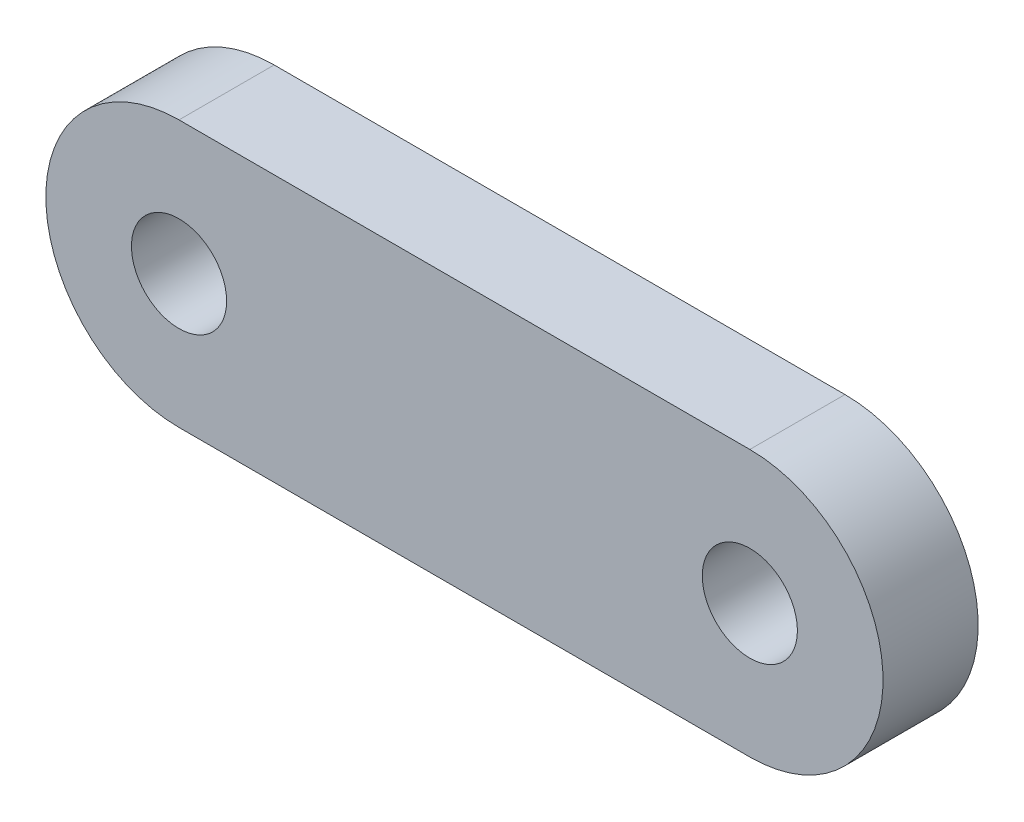
ISO-10303-21;
HEADER;
FILE_DESCRIPTION(('STEP AP214'),'2;1');
FILE_NAME('part.step','',(''),(''),'','','');
FILE_SCHEMA(('AUTOMOTIVE_DESIGN { 1 0 10303 214 1 1 1 1 }'));
ENDSEC;
DATA;
#1=APPLICATION_CONTEXT('core data for automotive mechanical design processes');
#2=APPLICATION_PROTOCOL_DEFINITION('international standard','automotive_design',2000,#1);
#3=PRODUCT_CONTEXT('',#1,'mechanical');
#4=PRODUCT('Part','Part','',(#3));
#5=PRODUCT_RELATED_PRODUCT_CATEGORY('part','',(#4));
#6=PRODUCT_DEFINITION_FORMATION('','',#4);
#7=PRODUCT_DEFINITION_CONTEXT('part definition',#1,'design');
#8=PRODUCT_DEFINITION('design','',#6,#7);
#9=PRODUCT_DEFINITION_SHAPE('','',#8);
#10=(LENGTH_UNIT() NAMED_UNIT(*) SI_UNIT(.MILLI.,.METRE.));
#11=(NAMED_UNIT(*) PLANE_ANGLE_UNIT() SI_UNIT($,.RADIAN.));
#12=(NAMED_UNIT(*) SI_UNIT($,.STERADIAN.) SOLID_ANGLE_UNIT());
#13=UNCERTAINTY_MEASURE_WITH_UNIT(LENGTH_MEASURE(1.E-05),#10,'distance_accuracy_value','');
#14=(GEOMETRIC_REPRESENTATION_CONTEXT(3) GLOBAL_UNCERTAINTY_ASSIGNED_CONTEXT((#13)) GLOBAL_UNIT_ASSIGNED_CONTEXT((#10,
#11,#12)) REPRESENTATION_CONTEXT('',''));
#15=CARTESIAN_POINT('',(0.,0.,0.));
#16=DIRECTION('',(0.,0.,1.));
#17=DIRECTION('',(1.,0.,0.));
#18=AXIS2_PLACEMENT_3D('',#15,#16,#17);
#19=CARTESIAN_POINT('',(19.05,0.,6.35));
#20=DIRECTION('',(0.,0.,-1.));
#21=DIRECTION('',(-1.,0.,0.));
#22=AXIS2_PLACEMENT_3D('',#19,#20,#21);
#23=PLANE('',#22);
#24=CARTESIAN_POINT('',(19.05,0.,6.35));
#25=DIRECTION('',(0.,0.,1.));
#26=DIRECTION('',(-1.,0.,0.));
#27=AXIS2_PLACEMENT_3D('',#24,#25,#26);
#28=CIRCLE('',#27,8.89);
#29=CARTESIAN_POINT('',(19.05,-8.89,6.35));
#30=VERTEX_POINT('',#29);
#31=CARTESIAN_POINT('',(19.05,8.89,6.35));
#32=VERTEX_POINT('',#31);
#33=EDGE_CURVE('E98',#30,#32,#28,.T.);
#34=ORIENTED_EDGE('',*,*,#33,.T.);
#35=DIRECTION('',(-1.,0.,0.));
#36=VECTOR('',#35,1.);
#37=CARTESIAN_POINT('',(-19.05,8.89,6.35));
#38=LINE('',#37,#36);
#39=CARTESIAN_POINT('',(-19.05,8.89,6.35));
#40=VERTEX_POINT('',#39);
#41=EDGE_CURVE('E91',#32,#40,#38,.T.);
#42=ORIENTED_EDGE('',*,*,#41,.T.);
#43=CARTESIAN_POINT('',(-19.05,0.,6.35));
#44=DIRECTION('',(0.,0.,1.));
#45=DIRECTION('',(1.,0.,0.));
#46=AXIS2_PLACEMENT_3D('',#43,#44,#45);
#47=CIRCLE('',#46,8.89);
#48=CARTESIAN_POINT('',(-19.05,-8.89,6.35));
#49=VERTEX_POINT('',#48);
#50=EDGE_CURVE('E96',#40,#49,#47,.T.);
#51=ORIENTED_EDGE('',*,*,#50,.T.);
#52=DIRECTION('',(1.,0.,0.));
#53=VECTOR('',#52,1.);
#54=CARTESIAN_POINT('',(-19.05,-8.89,6.35));
#55=LINE('',#54,#53);
#56=EDGE_CURVE('E65',#49,#30,#55,.T.);
#57=ORIENTED_EDGE('',*,*,#56,.T.);
#58=EDGE_LOOP('',(#34,#42,#51,#57));
#59=FACE_BOUND('',#58,.T.);
#60=CARTESIAN_POINT('',(-19.05,0.,6.35));
#61=DIRECTION('',(0.,0.,1.));
#62=DIRECTION('',(1.,0.,0.));
#63=AXIS2_PLACEMENT_3D('',#60,#61,#62);
#64=CIRCLE('',#63,3.175);
#65=CARTESIAN_POINT('',(-15.875,0.,6.35));
#66=VERTEX_POINT('',#65);
#67=EDGE_CURVE('E120',#66,#66,#64,.T.);
#68=ORIENTED_EDGE('',*,*,#67,.F.);
#69=EDGE_LOOP('',(#68));
#70=FACE_BOUND('',#69,.T.);
#71=CARTESIAN_POINT('',(19.05,0.,6.35));
#72=DIRECTION('',(0.,0.,1.));
#73=DIRECTION('',(1.,0.,0.));
#74=AXIS2_PLACEMENT_3D('',#71,#72,#73);
#75=CIRCLE('',#74,3.175);
#76=CARTESIAN_POINT('',(22.225,0.,6.35));
#77=VERTEX_POINT('',#76);
#78=EDGE_CURVE('E138',#77,#77,#75,.T.);
#79=ORIENTED_EDGE('',*,*,#78,.F.);
#80=EDGE_LOOP('',(#79));
#81=FACE_BOUND('',#80,.T.);
#82=ADVANCED_FACE('F44',(#59,#70,#81),#23,.F.);
#83=CARTESIAN_POINT('',(19.05,0.,0.));
#84=DIRECTION('',(0.,0.,-1.));
#85=DIRECTION('',(-1.,0.,0.));
#86=AXIS2_PLACEMENT_3D('',#83,#84,#85);
#87=PLANE('',#86);
#88=CARTESIAN_POINT('',(-19.05,0.,0.));
#89=DIRECTION('',(0.,0.,1.));
#90=DIRECTION('',(1.,0.,0.));
#91=AXIS2_PLACEMENT_3D('',#88,#89,#90);
#92=CIRCLE('',#91,3.175);
#93=CARTESIAN_POINT('',(-15.875,0.,0.));
#94=VERTEX_POINT('',#93);
#95=EDGE_CURVE('E137',#94,#94,#92,.T.);
#96=ORIENTED_EDGE('',*,*,#95,.T.);
#97=EDGE_LOOP('',(#96));
#98=FACE_BOUND('',#97,.T.);
#99=CARTESIAN_POINT('',(19.05,0.,0.));
#100=DIRECTION('',(0.,0.,1.));
#101=DIRECTION('',(-1.,0.,0.));
#102=AXIS2_PLACEMENT_3D('',#99,#100,#101);
#103=CIRCLE('',#102,8.89);
#104=CARTESIAN_POINT('',(19.05,-8.89,0.));
#105=VERTEX_POINT('',#104);
#106=CARTESIAN_POINT('',(19.05,8.89,0.));
#107=VERTEX_POINT('',#106);
#108=EDGE_CURVE('E111',#105,#107,#103,.T.);
#109=ORIENTED_EDGE('',*,*,#108,.F.);
#110=DIRECTION('',(1.,0.,0.));
#111=VECTOR('',#110,1.);
#112=CARTESIAN_POINT('',(-19.05,-8.89,0.));
#113=LINE('',#112,#111);
#114=CARTESIAN_POINT('',(-19.05,-8.89,0.));
#115=VERTEX_POINT('',#114);
#116=EDGE_CURVE('E88',#115,#105,#113,.T.);
#117=ORIENTED_EDGE('',*,*,#116,.F.);
#118=CARTESIAN_POINT('',(-19.05,0.,0.));
#119=DIRECTION('',(0.,0.,1.));
#120=DIRECTION('',(1.,0.,0.));
#121=AXIS2_PLACEMENT_3D('',#118,#119,#120);
#122=CIRCLE('',#121,8.89);
#123=CARTESIAN_POINT('',(-19.05,8.89,0.));
#124=VERTEX_POINT('',#123);
#125=EDGE_CURVE('E77',#124,#115,#122,.T.);
#126=ORIENTED_EDGE('',*,*,#125,.F.);
#127=DIRECTION('',(-1.,0.,0.));
#128=VECTOR('',#127,1.);
#129=CARTESIAN_POINT('',(-19.05,8.89,0.));
#130=LINE('',#129,#128);
#131=EDGE_CURVE('E103',#107,#124,#130,.T.);
#132=ORIENTED_EDGE('',*,*,#131,.F.);
#133=EDGE_LOOP('',(#109,#117,#126,#132));
#134=FACE_BOUND('',#133,.T.);
#135=CARTESIAN_POINT('',(19.05,0.,0.));
#136=DIRECTION('',(0.,0.,1.));
#137=DIRECTION('',(1.,0.,0.));
#138=AXIS2_PLACEMENT_3D('',#135,#136,#137);
#139=CIRCLE('',#138,3.175);
#140=CARTESIAN_POINT('',(22.225,0.,0.));
#141=VERTEX_POINT('',#140);
#142=EDGE_CURVE('E145',#141,#141,#139,.T.);
#143=ORIENTED_EDGE('',*,*,#142,.T.);
#144=EDGE_LOOP('',(#143));
#145=FACE_BOUND('',#144,.T.);
#146=ADVANCED_FACE('F134',(#98,#134,#145),#87,.T.);
#147=CARTESIAN_POINT('',(19.05,0.,6.35));
#148=DIRECTION('',(0.,0.,-1.));
#149=DIRECTION('',(-1.,0.,0.));
#150=AXIS2_PLACEMENT_3D('',#147,#148,#149);
#151=CYLINDRICAL_SURFACE('',#150,8.89);
#152=ORIENTED_EDGE('',*,*,#108,.T.);
#153=DIRECTION('',(0.,0.,-1.));
#154=VECTOR('',#153,1.);
#155=CARTESIAN_POINT('',(19.05,8.89,6.35));
#156=LINE('',#155,#154);
#157=EDGE_CURVE('E11',#32,#107,#156,.T.);
#158=ORIENTED_EDGE('',*,*,#157,.F.);
#159=ORIENTED_EDGE('',*,*,#33,.F.);
#160=DIRECTION('',(0.,0.,-1.));
#161=VECTOR('',#160,1.);
#162=CARTESIAN_POINT('',(19.05,-8.89,6.35));
#163=LINE('',#162,#161);
#164=EDGE_CURVE('E109',#30,#105,#163,.T.);
#165=ORIENTED_EDGE('',*,*,#164,.T.);
#166=EDGE_LOOP('',(#152,#158,#159,#165));
#167=FACE_BOUND('',#166,.T.);
#168=ADVANCED_FACE('F50',(#167),#151,.T.);
#169=CARTESIAN_POINT('',(-19.05,8.89,6.35));
#170=DIRECTION('',(0.,-1.,0.));
#171=DIRECTION('',(0.,0.,-1.));
#172=AXIS2_PLACEMENT_3D('',#169,#170,#171);
#173=PLANE('',#172);
#174=ORIENTED_EDGE('',*,*,#131,.T.);
#175=DIRECTION('',(0.,0.,-1.));
#176=VECTOR('',#175,1.);
#177=CARTESIAN_POINT('',(-19.05,8.89,6.35));
#178=LINE('',#177,#176);
#179=EDGE_CURVE('E54',#40,#124,#178,.T.);
#180=ORIENTED_EDGE('',*,*,#179,.F.);
#181=ORIENTED_EDGE('',*,*,#41,.F.);
#182=ORIENTED_EDGE('',*,*,#157,.T.);
#183=EDGE_LOOP('',(#174,#180,#181,#182));
#184=FACE_BOUND('',#183,.T.);
#185=ADVANCED_FACE('F105',(#184),#173,.F.);
#186=CARTESIAN_POINT('',(-19.05,0.,6.35));
#187=DIRECTION('',(0.,0.,-1.));
#188=DIRECTION('',(-1.,0.,0.));
#189=AXIS2_PLACEMENT_3D('',#186,#187,#188);
#190=CYLINDRICAL_SURFACE('',#189,8.89);
#191=ORIENTED_EDGE('',*,*,#125,.T.);
#192=DIRECTION('',(0.,0.,-1.));
#193=VECTOR('',#192,1.);
#194=CARTESIAN_POINT('',(-19.05,-8.89,6.35));
#195=LINE('',#194,#193);
#196=EDGE_CURVE('E104',#49,#115,#195,.T.);
#197=ORIENTED_EDGE('',*,*,#196,.F.);
#198=ORIENTED_EDGE('',*,*,#50,.F.);
#199=ORIENTED_EDGE('',*,*,#179,.T.);
#200=EDGE_LOOP('',(#191,#197,#198,#199));
#201=FACE_BOUND('',#200,.T.);
#202=ADVANCED_FACE('F106',(#201),#190,.T.);
#203=CARTESIAN_POINT('',(-19.05,-8.89,6.35));
#204=DIRECTION('',(0.,1.,0.));
#205=DIRECTION('',(0.,0.,1.));
#206=AXIS2_PLACEMENT_3D('',#203,#204,#205);
#207=PLANE('',#206);
#208=ORIENTED_EDGE('',*,*,#116,.T.);
#209=ORIENTED_EDGE('',*,*,#164,.F.);
#210=ORIENTED_EDGE('',*,*,#56,.F.);
#211=ORIENTED_EDGE('',*,*,#196,.T.);
#212=EDGE_LOOP('',(#208,#209,#210,#211));
#213=FACE_BOUND('',#212,.T.);
#214=ADVANCED_FACE('F126',(#213),#207,.F.);
#215=CARTESIAN_POINT('',(-19.05,0.,6.35));
#216=DIRECTION('',(0.,0.,-1.));
#217=DIRECTION('',(-1.,0.,0.));
#218=AXIS2_PLACEMENT_3D('',#215,#216,#217);
#219=CYLINDRICAL_SURFACE('',#218,3.175);
#220=ORIENTED_EDGE('',*,*,#67,.T.);
#221=EDGE_LOOP('',(#220));
#222=FACE_BOUND('',#221,.T.);
#223=ORIENTED_EDGE('',*,*,#95,.F.);
#224=EDGE_LOOP('',(#223));
#225=FACE_BOUND('',#224,.T.);
#226=ADVANCED_FACE('F162',(#222,#225),#219,.F.);
#227=CARTESIAN_POINT('',(19.05,0.,6.35));
#228=DIRECTION('',(0.,0.,-1.));
#229=DIRECTION('',(-1.,0.,0.));
#230=AXIS2_PLACEMENT_3D('',#227,#228,#229);
#231=CYLINDRICAL_SURFACE('',#230,3.175);
#232=ORIENTED_EDGE('',*,*,#78,.T.);
#233=EDGE_LOOP('',(#232));
#234=FACE_BOUND('',#233,.T.);
#235=ORIENTED_EDGE('',*,*,#142,.F.);
#236=EDGE_LOOP('',(#235));
#237=FACE_BOUND('',#236,.T.);
#238=ADVANCED_FACE('F155',(#234,#237),#231,.F.);
#239=CLOSED_SHELL('',(#82,#146,#168,#185,#202,#214,#226,#238));
#240=MANIFOLD_SOLID_BREP('B2',#239);
#241=ADVANCED_BREP_SHAPE_REPRESENTATION('',(#18,#240),#14);
#242=SHAPE_DEFINITION_REPRESENTATION(#9,#241);
ENDSEC;
END-ISO-10303-21;
